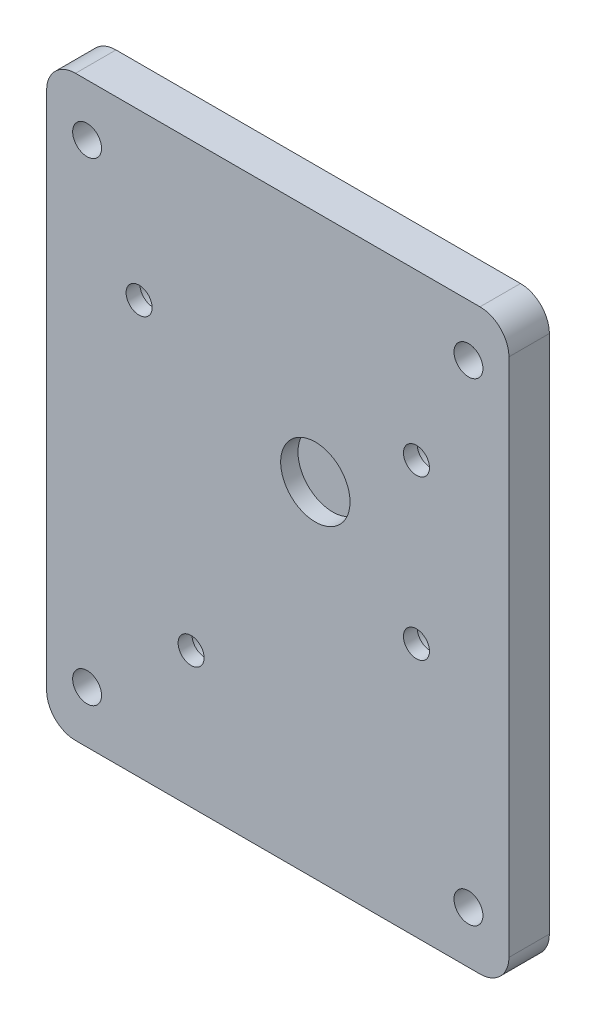
ISO-10303-21;
HEADER;
FILE_DESCRIPTION(('STEP AP214'),'2;1');
FILE_NAME('part.step','',(''),(''),'','','');
FILE_SCHEMA(('AUTOMOTIVE_DESIGN { 1 0 10303 214 1 1 1 1 }'));
ENDSEC;
DATA;
#1=APPLICATION_CONTEXT('core data for automotive mechanical design processes');
#2=APPLICATION_PROTOCOL_DEFINITION('international standard','automotive_design',2000,#1);
#3=PRODUCT_CONTEXT('',#1,'mechanical');
#4=PRODUCT('Part','Part','',(#3));
#5=PRODUCT_RELATED_PRODUCT_CATEGORY('part','',(#4));
#6=PRODUCT_DEFINITION_FORMATION('','',#4);
#7=PRODUCT_DEFINITION_CONTEXT('part definition',#1,'design');
#8=PRODUCT_DEFINITION('design','',#6,#7);
#9=PRODUCT_DEFINITION_SHAPE('','',#8);
#10=(LENGTH_UNIT() NAMED_UNIT(*) SI_UNIT(.MILLI.,.METRE.));
#11=(NAMED_UNIT(*) PLANE_ANGLE_UNIT() SI_UNIT($,.RADIAN.));
#12=(NAMED_UNIT(*) SI_UNIT($,.STERADIAN.) SOLID_ANGLE_UNIT());
#13=UNCERTAINTY_MEASURE_WITH_UNIT(LENGTH_MEASURE(1.E-05),#10,'distance_accuracy_value','');
#14=(GEOMETRIC_REPRESENTATION_CONTEXT(3) GLOBAL_UNCERTAINTY_ASSIGNED_CONTEXT((#13)) GLOBAL_UNIT_ASSIGNED_CONTEXT((#10,
#11,#12)) REPRESENTATION_CONTEXT('',''));
#15=CARTESIAN_POINT('',(0.,0.,0.));
#16=DIRECTION('',(0.,0.,1.));
#17=DIRECTION('',(1.,0.,0.));
#18=AXIS2_PLACEMENT_3D('',#15,#16,#17);
#19=CARTESIAN_POINT('',(6.5,9.5,0.));
#20=DIRECTION('',(0.,0.,1.));
#21=DIRECTION('',(1.,0.,0.));
#22=AXIS2_PLACEMENT_3D('',#19,#20,#21);
#23=CYLINDRICAL_SURFACE('',#22,6.);
#24=CARTESIAN_POINT('',(6.5,9.5,23.5));
#25=DIRECTION('',(0.,0.,1.));
#26=DIRECTION('',(1.,0.,0.));
#27=AXIS2_PLACEMENT_3D('',#24,#25,#26);
#28=CIRCLE('',#27,6.);
#29=CARTESIAN_POINT('',(12.5,9.5,23.5));
#30=VERTEX_POINT('',#29);
#31=EDGE_CURVE('E280',#30,#30,#28,.T.);
#32=ORIENTED_EDGE('',*,*,#31,.T.);
#33=EDGE_LOOP('',(#32));
#34=FACE_BOUND('',#33,.T.);
#35=CARTESIAN_POINT('',(6.5,9.5,20.5));
#36=DIRECTION('',(0.,0.,-1.));
#37=DIRECTION('',(-1.,0.,0.));
#38=AXIS2_PLACEMENT_3D('',#35,#36,#37);
#39=CIRCLE('',#38,6.);
#40=CARTESIAN_POINT('',(0.500000000000002,9.5,20.5));
#41=VERTEX_POINT('',#40);
#42=EDGE_CURVE('E151',#41,#41,#39,.F.);
#43=ORIENTED_EDGE('',*,*,#42,.F.);
#44=EDGE_LOOP('',(#43));
#45=FACE_BOUND('',#44,.T.);
#46=ADVANCED_FACE('F48',(#34,#45),#23,.F.);
#47=CARTESIAN_POINT('',(0.,0.,16.5));
#48=DIRECTION('',(0.,0.,1.));
#49=DIRECTION('',(1.,0.,0.));
#50=AXIS2_PLACEMENT_3D('',#47,#48,#49);
#51=PLANE('',#50);
#52=CARTESIAN_POINT('',(33.,41.,16.5));
#53=DIRECTION('',(0.,0.,1.));
#54=DIRECTION('',(1.,0.,0.));
#55=AXIS2_PLACEMENT_3D('',#52,#53,#54);
#56=CIRCLE('',#55,2.49999999999999);
#57=CARTESIAN_POINT('',(35.5,41.,16.5));
#58=VERTEX_POINT('',#57);
#59=EDGE_CURVE('E373',#58,#58,#56,.T.);
#60=ORIENTED_EDGE('',*,*,#59,.T.);
#61=EDGE_LOOP('',(#60));
#62=FACE_BOUND('',#61,.T.);
#63=CARTESIAN_POINT('',(-33.,41.,16.5));
#64=DIRECTION('',(0.,0.,1.));
#65=DIRECTION('',(1.,0.,0.));
#66=AXIS2_PLACEMENT_3D('',#63,#64,#65);
#67=CIRCLE('',#66,2.49999999999999);
#68=CARTESIAN_POINT('',(-30.5,41.,16.5));
#69=VERTEX_POINT('',#68);
#70=EDGE_CURVE('E363',#69,#69,#67,.T.);
#71=ORIENTED_EDGE('',*,*,#70,.T.);
#72=EDGE_LOOP('',(#71));
#73=FACE_BOUND('',#72,.T.);
#74=CARTESIAN_POINT('',(-33.,-41.,16.5));
#75=DIRECTION('',(0.,0.,1.));
#76=DIRECTION('',(1.,0.,0.));
#77=AXIS2_PLACEMENT_3D('',#74,#75,#76);
#78=CIRCLE('',#77,2.49999999999999);
#79=CARTESIAN_POINT('',(-30.5,-41.,16.5));
#80=VERTEX_POINT('',#79);
#81=EDGE_CURVE('E354',#80,#80,#78,.T.);
#82=ORIENTED_EDGE('',*,*,#81,.T.);
#83=EDGE_LOOP('',(#82));
#84=FACE_BOUND('',#83,.T.);
#85=CARTESIAN_POINT('',(33.,-41.,16.5));
#86=DIRECTION('',(0.,0.,1.));
#87=DIRECTION('',(1.,0.,0.));
#88=AXIS2_PLACEMENT_3D('',#85,#86,#87);
#89=CIRCLE('',#88,2.49999999999999);
#90=CARTESIAN_POINT('',(35.5,-41.,16.5));
#91=VERTEX_POINT('',#90);
#92=EDGE_CURVE('E335',#91,#91,#89,.T.);
#93=ORIENTED_EDGE('',*,*,#92,.T.);
#94=EDGE_LOOP('',(#93));
#95=FACE_BOUND('',#94,.T.);
#96=CARTESIAN_POINT('',(24.,-6.,16.5));
#97=DIRECTION('',(0.,0.,-1.));
#98=DIRECTION('',(-1.,0.,0.));
#99=AXIS2_PLACEMENT_3D('',#96,#97,#98);
#100=CIRCLE('',#99,4.);
#101=CARTESIAN_POINT('',(20.,-6.,16.5));
#102=VERTEX_POINT('',#101);
#103=EDGE_CURVE('E236',#102,#102,#100,.T.);
#104=ORIENTED_EDGE('',*,*,#103,.F.);
#105=EDGE_LOOP('',(#104));
#106=FACE_BOUND('',#105,.T.);
#107=CARTESIAN_POINT('',(-15.,-26.5,16.5));
#108=DIRECTION('',(0.,0.,1.));
#109=DIRECTION('',(1.,0.,0.));
#110=AXIS2_PLACEMENT_3D('',#107,#108,#109);
#111=CIRCLE('',#110,4.);
#112=CARTESIAN_POINT('',(-11.,-26.5,16.5));
#113=VERTEX_POINT('',#112);
#114=EDGE_CURVE('E284',#113,#113,#111,.T.);
#115=ORIENTED_EDGE('',*,*,#114,.T.);
#116=EDGE_LOOP('',(#115));
#117=FACE_BOUND('',#116,.T.);
#118=DIRECTION('',(1.,0.,0.));
#119=VECTOR('',#118,1.);
#120=CARTESIAN_POINT('',(-40.,50.,16.5));
#121=LINE('',#120,#119);
#122=CARTESIAN_POINT('',(-35.,50.,16.5));
#123=VERTEX_POINT('',#122);
#124=CARTESIAN_POINT('',(35.,50.,16.5));
#125=VERTEX_POINT('',#124);
#126=EDGE_CURVE('E122',#123,#125,#121,.T.);
#127=ORIENTED_EDGE('',*,*,#126,.T.);
#128=CARTESIAN_POINT('',(35.,45.,16.5));
#129=DIRECTION('',(0.,0.,1.));
#130=DIRECTION('',(1.,0.,0.));
#131=AXIS2_PLACEMENT_3D('',#128,#129,#130);
#132=CIRCLE('',#131,5.);
#133=CARTESIAN_POINT('',(40.,45.,16.5));
#134=VERTEX_POINT('',#133);
#135=EDGE_CURVE('E115',#125,#134,#132,.F.);
#136=ORIENTED_EDGE('',*,*,#135,.T.);
#137=DIRECTION('',(0.,-1.,0.));
#138=VECTOR('',#137,1.);
#139=CARTESIAN_POINT('',(40.,-50.,16.5));
#140=LINE('',#139,#138);
#141=CARTESIAN_POINT('',(40.,-45.,16.5));
#142=VERTEX_POINT('',#141);
#143=EDGE_CURVE('E119',#134,#142,#140,.T.);
#144=ORIENTED_EDGE('',*,*,#143,.T.);
#145=CARTESIAN_POINT('',(35.,-45.,16.5));
#146=DIRECTION('',(0.,0.,1.));
#147=DIRECTION('',(1.,0.,0.));
#148=AXIS2_PLACEMENT_3D('',#145,#146,#147);
#149=CIRCLE('',#148,5.);
#150=CARTESIAN_POINT('',(35.,-50.,16.5));
#151=VERTEX_POINT('',#150);
#152=EDGE_CURVE('E128',#142,#151,#149,.F.);
#153=ORIENTED_EDGE('',*,*,#152,.T.);
#154=DIRECTION('',(-1.,0.,0.));
#155=VECTOR('',#154,1.);
#156=CARTESIAN_POINT('',(-40.,-50.,16.5));
#157=LINE('',#156,#155);
#158=CARTESIAN_POINT('',(-35.,-50.,16.5));
#159=VERTEX_POINT('',#158);
#160=EDGE_CURVE('E139',#151,#159,#157,.T.);
#161=ORIENTED_EDGE('',*,*,#160,.T.);
#162=CARTESIAN_POINT('',(-35.,-45.,16.5));
#163=DIRECTION('',(0.,0.,1.));
#164=DIRECTION('',(1.,0.,0.));
#165=AXIS2_PLACEMENT_3D('',#162,#163,#164);
#166=CIRCLE('',#165,5.);
#167=CARTESIAN_POINT('',(-40.,-45.,16.5));
#168=VERTEX_POINT('',#167);
#169=EDGE_CURVE('E70',#159,#168,#166,.F.);
#170=ORIENTED_EDGE('',*,*,#169,.T.);
#171=DIRECTION('',(0.,1.,0.));
#172=VECTOR('',#171,1.);
#173=CARTESIAN_POINT('',(-40.,-50.,16.5));
#174=LINE('',#173,#172);
#175=CARTESIAN_POINT('',(-40.,45.,16.5));
#176=VERTEX_POINT('',#175);
#177=EDGE_CURVE('E209',#168,#176,#174,.T.);
#178=ORIENTED_EDGE('',*,*,#177,.T.);
#179=CARTESIAN_POINT('',(-35.,45.,16.5));
#180=DIRECTION('',(0.,0.,1.));
#181=DIRECTION('',(1.,0.,0.));
#182=AXIS2_PLACEMENT_3D('',#179,#180,#181);
#183=CIRCLE('',#182,5.);
#184=EDGE_CURVE('E169',#176,#123,#183,.F.);
#185=ORIENTED_EDGE('',*,*,#184,.T.);
#186=EDGE_LOOP('',(#127,#136,#144,#153,#161,#170,#178,#185));
#187=FACE_BOUND('',#186,.T.);
#188=CARTESIAN_POINT('',(-24.,21.5,16.5));
#189=DIRECTION('',(0.,0.,-1.));
#190=DIRECTION('',(-1.,0.,0.));
#191=AXIS2_PLACEMENT_3D('',#188,#189,#190);
#192=CIRCLE('',#191,4.);
#193=CARTESIAN_POINT('',(-28.,21.5,16.5));
#194=VERTEX_POINT('',#193);
#195=EDGE_CURVE('E264',#194,#194,#192,.T.);
#196=ORIENTED_EDGE('',*,*,#195,.F.);
#197=EDGE_LOOP('',(#196));
#198=FACE_BOUND('',#197,.T.);
#199=CARTESIAN_POINT('',(24.,21.5,16.5));
#200=DIRECTION('',(0.,0.,-1.));
#201=DIRECTION('',(-1.,0.,0.));
#202=AXIS2_PLACEMENT_3D('',#199,#200,#201);
#203=CIRCLE('',#202,4.);
#204=CARTESIAN_POINT('',(20.,21.5,16.5));
#205=VERTEX_POINT('',#204);
#206=EDGE_CURVE('E220',#205,#205,#203,.T.);
#207=ORIENTED_EDGE('',*,*,#206,.F.);
#208=EDGE_LOOP('',(#207));
#209=FACE_BOUND('',#208,.T.);
#210=ADVANCED_FACE('F117',(#62,#73,#84,#95,#106,#117,#187,#198,#209),#51,.F.);
#211=CARTESIAN_POINT('',(0.,0.,23.5));
#212=DIRECTION('',(0.,0.,1.));
#213=DIRECTION('',(1.,0.,0.));
#214=AXIS2_PLACEMENT_3D('',#211,#212,#213);
#215=PLANE('',#214);
#216=CARTESIAN_POINT('',(33.,41.,23.5));
#217=DIRECTION('',(0.,0.,1.));
#218=DIRECTION('',(1.,0.,0.));
#219=AXIS2_PLACEMENT_3D('',#216,#217,#218);
#220=CIRCLE('',#219,2.49999999999999);
#221=CARTESIAN_POINT('',(35.5,41.,23.5));
#222=VERTEX_POINT('',#221);
#223=EDGE_CURVE('E378',#222,#222,#220,.T.);
#224=ORIENTED_EDGE('',*,*,#223,.F.);
#225=EDGE_LOOP('',(#224));
#226=FACE_BOUND('',#225,.T.);
#227=CARTESIAN_POINT('',(-33.,41.,23.5));
#228=DIRECTION('',(0.,0.,1.));
#229=DIRECTION('',(1.,0.,0.));
#230=AXIS2_PLACEMENT_3D('',#227,#228,#229);
#231=CIRCLE('',#230,2.49999999999999);
#232=CARTESIAN_POINT('',(-30.5,41.,23.5));
#233=VERTEX_POINT('',#232);
#234=EDGE_CURVE('E368',#233,#233,#231,.T.);
#235=ORIENTED_EDGE('',*,*,#234,.F.);
#236=EDGE_LOOP('',(#235));
#237=FACE_BOUND('',#236,.T.);
#238=CARTESIAN_POINT('',(-33.,-41.,23.5));
#239=DIRECTION('',(0.,0.,1.));
#240=DIRECTION('',(1.,0.,0.));
#241=AXIS2_PLACEMENT_3D('',#238,#239,#240);
#242=CIRCLE('',#241,2.49999999999999);
#243=CARTESIAN_POINT('',(-30.5,-41.,23.5));
#244=VERTEX_POINT('',#243);
#245=EDGE_CURVE('E358',#244,#244,#242,.T.);
#246=ORIENTED_EDGE('',*,*,#245,.F.);
#247=EDGE_LOOP('',(#246));
#248=FACE_BOUND('',#247,.T.);
#249=CARTESIAN_POINT('',(33.,-41.,23.5));
#250=DIRECTION('',(0.,0.,1.));
#251=DIRECTION('',(1.,0.,0.));
#252=AXIS2_PLACEMENT_3D('',#249,#250,#251);
#253=CIRCLE('',#252,2.49999999999999);
#254=CARTESIAN_POINT('',(35.5,-41.,23.5));
#255=VERTEX_POINT('',#254);
#256=EDGE_CURVE('E350',#255,#255,#253,.T.);
#257=ORIENTED_EDGE('',*,*,#256,.F.);
#258=EDGE_LOOP('',(#257));
#259=FACE_BOUND('',#258,.T.);
#260=CARTESIAN_POINT('',(24.,21.5,23.5));
#261=DIRECTION('',(0.,0.,-1.));
#262=DIRECTION('',(-1.,0.,0.));
#263=AXIS2_PLACEMENT_3D('',#260,#261,#262);
#264=CIRCLE('',#263,2.25);
#265=CARTESIAN_POINT('',(21.75,21.5,23.5));
#266=VERTEX_POINT('',#265);
#267=EDGE_CURVE('E232',#266,#266,#264,.T.);
#268=ORIENTED_EDGE('',*,*,#267,.T.);
#269=EDGE_LOOP('',(#268));
#270=FACE_BOUND('',#269,.T.);
#271=CARTESIAN_POINT('',(24.,-6.,23.5));
#272=DIRECTION('',(0.,0.,-1.));
#273=DIRECTION('',(-1.,0.,0.));
#274=AXIS2_PLACEMENT_3D('',#271,#272,#273);
#275=CIRCLE('',#274,2.25);
#276=CARTESIAN_POINT('',(21.75,-6.,23.5));
#277=VERTEX_POINT('',#276);
#278=EDGE_CURVE('E248',#277,#277,#275,.T.);
#279=ORIENTED_EDGE('',*,*,#278,.T.);
#280=EDGE_LOOP('',(#279));
#281=FACE_BOUND('',#280,.T.);
#282=CARTESIAN_POINT('',(-15.,-26.5,23.5));
#283=DIRECTION('',(0.,0.,-1.));
#284=DIRECTION('',(-1.,0.,0.));
#285=AXIS2_PLACEMENT_3D('',#282,#283,#284);
#286=CIRCLE('',#285,2.25);
#287=CARTESIAN_POINT('',(-17.25,-26.5,23.5));
#288=VERTEX_POINT('',#287);
#289=EDGE_CURVE('E260',#288,#288,#286,.T.);
#290=ORIENTED_EDGE('',*,*,#289,.T.);
#291=EDGE_LOOP('',(#290));
#292=FACE_BOUND('',#291,.T.);
#293=CARTESIAN_POINT('',(-24.,21.5,23.5));
#294=DIRECTION('',(0.,0.,-1.));
#295=DIRECTION('',(-1.,0.,0.));
#296=AXIS2_PLACEMENT_3D('',#293,#294,#295);
#297=CIRCLE('',#296,2.25);
#298=CARTESIAN_POINT('',(-26.25,21.5,23.5));
#299=VERTEX_POINT('',#298);
#300=EDGE_CURVE('E276',#299,#299,#297,.T.);
#301=ORIENTED_EDGE('',*,*,#300,.T.);
#302=EDGE_LOOP('',(#301));
#303=FACE_BOUND('',#302,.T.);
#304=ORIENTED_EDGE('',*,*,#31,.F.);
#305=EDGE_LOOP('',(#304));
#306=FACE_BOUND('',#305,.T.);
#307=DIRECTION('',(0.,1.,0.));
#308=VECTOR('',#307,1.);
#309=CARTESIAN_POINT('',(40.,-50.,23.5));
#310=LINE('',#309,#308);
#311=CARTESIAN_POINT('',(40.,-45.,23.5));
#312=VERTEX_POINT('',#311);
#313=CARTESIAN_POINT('',(40.,45.,23.5));
#314=VERTEX_POINT('',#313);
#315=EDGE_CURVE('E340',#312,#314,#310,.T.);
#316=ORIENTED_EDGE('',*,*,#315,.T.);
#317=CARTESIAN_POINT('',(35.,45.,23.5));
#318=DIRECTION('',(0.,0.,1.));
#319=DIRECTION('',(1.,0.,0.));
#320=AXIS2_PLACEMENT_3D('',#317,#318,#319);
#321=CIRCLE('',#320,5.);
#322=CARTESIAN_POINT('',(35.,50.,23.5));
#323=VERTEX_POINT('',#322);
#324=EDGE_CURVE('E142',#314,#323,#321,.T.);
#325=ORIENTED_EDGE('',*,*,#324,.T.);
#326=DIRECTION('',(-1.,0.,0.));
#327=VECTOR('',#326,1.);
#328=CARTESIAN_POINT('',(-40.,50.,23.5));
#329=LINE('',#328,#327);
#330=CARTESIAN_POINT('',(-35.,50.,23.5));
#331=VERTEX_POINT('',#330);
#332=EDGE_CURVE('E216',#323,#331,#329,.T.);
#333=ORIENTED_EDGE('',*,*,#332,.T.);
#334=CARTESIAN_POINT('',(-35.,45.,23.5));
#335=DIRECTION('',(0.,0.,1.));
#336=DIRECTION('',(1.,0.,0.));
#337=AXIS2_PLACEMENT_3D('',#334,#335,#336);
#338=CIRCLE('',#337,5.);
#339=CARTESIAN_POINT('',(-40.,45.,23.5));
#340=VERTEX_POINT('',#339);
#341=EDGE_CURVE('E144',#331,#340,#338,.T.);
#342=ORIENTED_EDGE('',*,*,#341,.T.);
#343=DIRECTION('',(0.,-1.,0.));
#344=VECTOR('',#343,1.);
#345=CARTESIAN_POINT('',(-40.,-50.,23.5));
#346=LINE('',#345,#344);
#347=CARTESIAN_POINT('',(-40.,-45.,23.5));
#348=VERTEX_POINT('',#347);
#349=EDGE_CURVE('E210',#340,#348,#346,.T.);
#350=ORIENTED_EDGE('',*,*,#349,.T.);
#351=CARTESIAN_POINT('',(-35.,-45.,23.5));
#352=DIRECTION('',(0.,0.,1.));
#353=DIRECTION('',(1.,0.,0.));
#354=AXIS2_PLACEMENT_3D('',#351,#352,#353);
#355=CIRCLE('',#354,5.);
#356=CARTESIAN_POINT('',(-35.,-50.,23.5));
#357=VERTEX_POINT('',#356);
#358=EDGE_CURVE('E149',#348,#357,#355,.T.);
#359=ORIENTED_EDGE('',*,*,#358,.T.);
#360=DIRECTION('',(1.,0.,0.));
#361=VECTOR('',#360,1.);
#362=CARTESIAN_POINT('',(-40.,-50.,23.5));
#363=LINE('',#362,#361);
#364=CARTESIAN_POINT('',(35.,-50.,23.5));
#365=VERTEX_POINT('',#364);
#366=EDGE_CURVE('E202',#357,#365,#363,.T.);
#367=ORIENTED_EDGE('',*,*,#366,.T.);
#368=CARTESIAN_POINT('',(35.,-45.,23.5));
#369=DIRECTION('',(0.,0.,1.));
#370=DIRECTION('',(1.,0.,0.));
#371=AXIS2_PLACEMENT_3D('',#368,#369,#370);
#372=CIRCLE('',#371,5.);
#373=EDGE_CURVE('E157',#365,#312,#372,.T.);
#374=ORIENTED_EDGE('',*,*,#373,.T.);
#375=EDGE_LOOP('',(#316,#325,#333,#342,#350,#359,#367,#374));
#376=FACE_BOUND('',#375,.T.);
#377=ADVANCED_FACE('F206',(#226,#237,#248,#259,#270,#281,#292,#303,#306,#376),#215,.T.);
#378=CARTESIAN_POINT('',(-21.75,21.5,21.1));
#379=DIRECTION('',(0.,0.,1.));
#380=DIRECTION('',(1.,0.,0.));
#381=AXIS2_PLACEMENT_3D('',#378,#379,#380);
#382=PLANE('',#381);
#383=CARTESIAN_POINT('',(-24.,21.5,21.1));
#384=DIRECTION('',(0.,0.,-1.));
#385=DIRECTION('',(-1.,0.,0.));
#386=AXIS2_PLACEMENT_3D('',#383,#384,#385);
#387=CIRCLE('',#386,2.25);
#388=CARTESIAN_POINT('',(-26.25,21.5,21.1));
#389=VERTEX_POINT('',#388);
#390=EDGE_CURVE('E272',#389,#389,#387,.T.);
#391=ORIENTED_EDGE('',*,*,#390,.F.);
#392=EDGE_LOOP('',(#391));
#393=FACE_BOUND('',#392,.T.);
#394=CARTESIAN_POINT('',(-24.,21.5,21.1));
#395=DIRECTION('',(0.,0.,-1.));
#396=DIRECTION('',(-1.,0.,0.));
#397=AXIS2_PLACEMENT_3D('',#394,#395,#396);
#398=CIRCLE('',#397,4.);
#399=CARTESIAN_POINT('',(-28.,21.5,21.1));
#400=VERTEX_POINT('',#399);
#401=EDGE_CURVE('E268',#400,#400,#398,.T.);
#402=ORIENTED_EDGE('',*,*,#401,.T.);
#403=EDGE_LOOP('',(#402));
#404=FACE_BOUND('',#403,.T.);
#405=ADVANCED_FACE('F308',(#393,#404),#382,.F.);
#406=CARTESIAN_POINT('',(-24.,21.5,16.5));
#407=DIRECTION('',(0.,0.,-1.));
#408=DIRECTION('',(-1.,0.,0.));
#409=AXIS2_PLACEMENT_3D('',#406,#407,#408);
#410=CYLINDRICAL_SURFACE('',#409,4.);
#411=ORIENTED_EDGE('',*,*,#401,.F.);
#412=EDGE_LOOP('',(#411));
#413=FACE_BOUND('',#412,.T.);
#414=ORIENTED_EDGE('',*,*,#195,.T.);
#415=EDGE_LOOP('',(#414));
#416=FACE_BOUND('',#415,.T.);
#417=ADVANCED_FACE('F407',(#413,#416),#410,.F.);
#418=CARTESIAN_POINT('',(-24.,21.5,16.5));
#419=DIRECTION('',(0.,0.,-1.));
#420=DIRECTION('',(-1.,0.,0.));
#421=AXIS2_PLACEMENT_3D('',#418,#419,#420);
#422=CYLINDRICAL_SURFACE('',#421,2.25);
#423=ORIENTED_EDGE('',*,*,#300,.F.);
#424=EDGE_LOOP('',(#423));
#425=FACE_BOUND('',#424,.T.);
#426=ORIENTED_EDGE('',*,*,#390,.T.);
#427=EDGE_LOOP('',(#426));
#428=FACE_BOUND('',#427,.T.);
#429=ADVANCED_FACE('F306',(#425,#428),#422,.F.);
#430=CARTESIAN_POINT('',(-12.75,-26.5,21.1));
#431=DIRECTION('',(0.,0.,1.));
#432=DIRECTION('',(1.,0.,0.));
#433=AXIS2_PLACEMENT_3D('',#430,#431,#432);
#434=PLANE('',#433);
#435=CARTESIAN_POINT('',(-15.,-26.5,21.1));
#436=DIRECTION('',(0.,0.,-1.));
#437=DIRECTION('',(-1.,0.,0.));
#438=AXIS2_PLACEMENT_3D('',#435,#436,#437);
#439=CIRCLE('',#438,2.25);
#440=CARTESIAN_POINT('',(-17.25,-26.5,21.1));
#441=VERTEX_POINT('',#440);
#442=EDGE_CURVE('E256',#441,#441,#439,.T.);
#443=ORIENTED_EDGE('',*,*,#442,.F.);
#444=EDGE_LOOP('',(#443));
#445=FACE_BOUND('',#444,.T.);
#446=CARTESIAN_POINT('',(-15.,-26.5,21.1));
#447=DIRECTION('',(0.,0.,-1.));
#448=DIRECTION('',(-1.,0.,0.));
#449=AXIS2_PLACEMENT_3D('',#446,#447,#448);
#450=CIRCLE('',#449,4.);
#451=CARTESIAN_POINT('',(-19.,-26.5,21.1));
#452=VERTEX_POINT('',#451);
#453=EDGE_CURVE('E252',#452,#452,#450,.T.);
#454=ORIENTED_EDGE('',*,*,#453,.T.);
#455=EDGE_LOOP('',(#454));
#456=FACE_BOUND('',#455,.T.);
#457=ADVANCED_FACE('F406',(#445,#456),#434,.F.);
#458=CARTESIAN_POINT('',(-15.,-26.5,16.5));
#459=DIRECTION('',(0.,0.,-1.));
#460=DIRECTION('',(-1.,0.,0.));
#461=AXIS2_PLACEMENT_3D('',#458,#459,#460);
#462=CYLINDRICAL_SURFACE('',#461,4.);
#463=ORIENTED_EDGE('',*,*,#453,.F.);
#464=EDGE_LOOP('',(#463));
#465=FACE_BOUND('',#464,.T.);
#466=ORIENTED_EDGE('',*,*,#114,.F.);
#467=EDGE_LOOP('',(#466));
#468=FACE_BOUND('',#467,.T.);
#469=ADVANCED_FACE('F452',(#465,#468),#462,.F.);
#470=CARTESIAN_POINT('',(-15.,-26.5,16.5));
#471=DIRECTION('',(0.,0.,-1.));
#472=DIRECTION('',(-1.,0.,0.));
#473=AXIS2_PLACEMENT_3D('',#470,#471,#472);
#474=CYLINDRICAL_SURFACE('',#473,2.25);
#475=ORIENTED_EDGE('',*,*,#289,.F.);
#476=EDGE_LOOP('',(#475));
#477=FACE_BOUND('',#476,.T.);
#478=ORIENTED_EDGE('',*,*,#442,.T.);
#479=EDGE_LOOP('',(#478));
#480=FACE_BOUND('',#479,.T.);
#481=ADVANCED_FACE('F447',(#477,#480),#474,.F.);
#482=CARTESIAN_POINT('',(26.25,-6.,21.1));
#483=DIRECTION('',(0.,0.,1.));
#484=DIRECTION('',(1.,0.,0.));
#485=AXIS2_PLACEMENT_3D('',#482,#483,#484);
#486=PLANE('',#485);
#487=CARTESIAN_POINT('',(24.,-6.,21.1));
#488=DIRECTION('',(0.,0.,-1.));
#489=DIRECTION('',(-1.,0.,0.));
#490=AXIS2_PLACEMENT_3D('',#487,#488,#489);
#491=CIRCLE('',#490,2.25);
#492=CARTESIAN_POINT('',(21.75,-6.,21.1));
#493=VERTEX_POINT('',#492);
#494=EDGE_CURVE('E244',#493,#493,#491,.T.);
#495=ORIENTED_EDGE('',*,*,#494,.F.);
#496=EDGE_LOOP('',(#495));
#497=FACE_BOUND('',#496,.T.);
#498=CARTESIAN_POINT('',(24.,-6.,21.1));
#499=DIRECTION('',(0.,0.,-1.));
#500=DIRECTION('',(-1.,0.,0.));
#501=AXIS2_PLACEMENT_3D('',#498,#499,#500);
#502=CIRCLE('',#501,4.);
#503=CARTESIAN_POINT('',(20.,-6.,21.1));
#504=VERTEX_POINT('',#503);
#505=EDGE_CURVE('E240',#504,#504,#502,.T.);
#506=ORIENTED_EDGE('',*,*,#505,.T.);
#507=EDGE_LOOP('',(#506));
#508=FACE_BOUND('',#507,.T.);
#509=ADVANCED_FACE('F443',(#497,#508),#486,.F.);
#510=CARTESIAN_POINT('',(24.,-6.,16.5));
#511=DIRECTION('',(0.,0.,-1.));
#512=DIRECTION('',(-1.,0.,0.));
#513=AXIS2_PLACEMENT_3D('',#510,#511,#512);
#514=CYLINDRICAL_SURFACE('',#513,4.);
#515=ORIENTED_EDGE('',*,*,#505,.F.);
#516=EDGE_LOOP('',(#515));
#517=FACE_BOUND('',#516,.T.);
#518=ORIENTED_EDGE('',*,*,#103,.T.);
#519=EDGE_LOOP('',(#518));
#520=FACE_BOUND('',#519,.T.);
#521=ADVANCED_FACE('F440',(#517,#520),#514,.F.);
#522=CARTESIAN_POINT('',(24.,-6.,16.5));
#523=DIRECTION('',(0.,0.,-1.));
#524=DIRECTION('',(-1.,0.,0.));
#525=AXIS2_PLACEMENT_3D('',#522,#523,#524);
#526=CYLINDRICAL_SURFACE('',#525,2.25);
#527=ORIENTED_EDGE('',*,*,#278,.F.);
#528=EDGE_LOOP('',(#527));
#529=FACE_BOUND('',#528,.T.);
#530=ORIENTED_EDGE('',*,*,#494,.T.);
#531=EDGE_LOOP('',(#530));
#532=FACE_BOUND('',#531,.T.);
#533=ADVANCED_FACE('F433',(#529,#532),#526,.F.);
#534=CARTESIAN_POINT('',(26.25,21.5,21.1));
#535=DIRECTION('',(0.,0.,1.));
#536=DIRECTION('',(1.,0.,0.));
#537=AXIS2_PLACEMENT_3D('',#534,#535,#536);
#538=PLANE('',#537);
#539=CARTESIAN_POINT('',(24.,21.5,21.1));
#540=DIRECTION('',(0.,0.,-1.));
#541=DIRECTION('',(-1.,0.,0.));
#542=AXIS2_PLACEMENT_3D('',#539,#540,#541);
#543=CIRCLE('',#542,2.25);
#544=CARTESIAN_POINT('',(21.75,21.5,21.1));
#545=VERTEX_POINT('',#544);
#546=EDGE_CURVE('E228',#545,#545,#543,.T.);
#547=ORIENTED_EDGE('',*,*,#546,.F.);
#548=EDGE_LOOP('',(#547));
#549=FACE_BOUND('',#548,.T.);
#550=CARTESIAN_POINT('',(24.,21.5,21.1));
#551=DIRECTION('',(0.,0.,-1.));
#552=DIRECTION('',(-1.,0.,0.));
#553=AXIS2_PLACEMENT_3D('',#550,#551,#552);
#554=CIRCLE('',#553,4.);
#555=CARTESIAN_POINT('',(20.,21.5,21.1));
#556=VERTEX_POINT('',#555);
#557=EDGE_CURVE('E224',#556,#556,#554,.T.);
#558=ORIENTED_EDGE('',*,*,#557,.T.);
#559=EDGE_LOOP('',(#558));
#560=FACE_BOUND('',#559,.T.);
#561=ADVANCED_FACE('F424',(#549,#560),#538,.F.);
#562=CARTESIAN_POINT('',(24.,21.5,16.5));
#563=DIRECTION('',(0.,0.,-1.));
#564=DIRECTION('',(-1.,0.,0.));
#565=AXIS2_PLACEMENT_3D('',#562,#563,#564);
#566=CYLINDRICAL_SURFACE('',#565,4.);
#567=ORIENTED_EDGE('',*,*,#557,.F.);
#568=EDGE_LOOP('',(#567));
#569=FACE_BOUND('',#568,.T.);
#570=ORIENTED_EDGE('',*,*,#206,.T.);
#571=EDGE_LOOP('',(#570));
#572=FACE_BOUND('',#571,.T.);
#573=ADVANCED_FACE('F421',(#569,#572),#566,.F.);
#574=CARTESIAN_POINT('',(24.,21.5,16.5));
#575=DIRECTION('',(0.,0.,-1.));
#576=DIRECTION('',(-1.,0.,0.));
#577=AXIS2_PLACEMENT_3D('',#574,#575,#576);
#578=CYLINDRICAL_SURFACE('',#577,2.25);
#579=ORIENTED_EDGE('',*,*,#267,.F.);
#580=EDGE_LOOP('',(#579));
#581=FACE_BOUND('',#580,.T.);
#582=ORIENTED_EDGE('',*,*,#546,.T.);
#583=EDGE_LOOP('',(#582));
#584=FACE_BOUND('',#583,.T.);
#585=ADVANCED_FACE('F423',(#581,#584),#578,.F.);
#586=CARTESIAN_POINT('',(-40.,50.,-111.562484748657));
#587=DIRECTION('',(0.,1.,0.));
#588=DIRECTION('',(0.,0.,1.));
#589=AXIS2_PLACEMENT_3D('',#586,#587,#588);
#590=PLANE('',#589);
#591=ORIENTED_EDGE('',*,*,#332,.F.);
#592=DIRECTION('',(0.,0.,1.));
#593=VECTOR('',#592,1.);
#594=CARTESIAN_POINT('',(35.,50.,-111.562484748657));
#595=LINE('',#594,#593);
#596=EDGE_CURVE('E166',#323,#125,#595,.F.);
#597=ORIENTED_EDGE('',*,*,#596,.T.);
#598=ORIENTED_EDGE('',*,*,#126,.F.);
#599=DIRECTION('',(0.,0.,1.));
#600=VECTOR('',#599,1.);
#601=CARTESIAN_POINT('',(-35.,50.,-111.562484748657));
#602=LINE('',#601,#600);
#603=EDGE_CURVE('E162',#123,#331,#602,.T.);
#604=ORIENTED_EDGE('',*,*,#603,.T.);
#605=EDGE_LOOP('',(#591,#597,#598,#604));
#606=FACE_BOUND('',#605,.T.);
#607=ADVANCED_FACE('F330',(#606),#590,.T.);
#608=CARTESIAN_POINT('',(-40.,-50.,-111.562484748657));
#609=DIRECTION('',(-1.,0.,0.));
#610=DIRECTION('',(0.,0.,1.));
#611=AXIS2_PLACEMENT_3D('',#608,#609,#610);
#612=PLANE('',#611);
#613=ORIENTED_EDGE('',*,*,#177,.F.);
#614=DIRECTION('',(0.,0.,1.));
#615=VECTOR('',#614,1.);
#616=CARTESIAN_POINT('',(-40.,-45.,-111.562484748657));
#617=LINE('',#616,#615);
#618=EDGE_CURVE('E11',#168,#348,#617,.T.);
#619=ORIENTED_EDGE('',*,*,#618,.T.);
#620=ORIENTED_EDGE('',*,*,#349,.F.);
#621=DIRECTION('',(0.,0.,1.));
#622=VECTOR('',#621,1.);
#623=CARTESIAN_POINT('',(-40.,45.,-111.562484748657));
#624=LINE('',#623,#622);
#625=EDGE_CURVE('E57',#340,#176,#624,.F.);
#626=ORIENTED_EDGE('',*,*,#625,.T.);
#627=EDGE_LOOP('',(#613,#619,#620,#626));
#628=FACE_BOUND('',#627,.T.);
#629=ADVANCED_FACE('F324',(#628),#612,.T.);
#630=CARTESIAN_POINT('',(-40.,-50.,-111.562484748657));
#631=DIRECTION('',(0.,-1.,0.));
#632=DIRECTION('',(0.,0.,-1.));
#633=AXIS2_PLACEMENT_3D('',#630,#631,#632);
#634=PLANE('',#633);
#635=ORIENTED_EDGE('',*,*,#160,.F.);
#636=DIRECTION('',(0.,0.,1.));
#637=VECTOR('',#636,1.);
#638=CARTESIAN_POINT('',(35.,-50.,-111.562484748657));
#639=LINE('',#638,#637);
#640=EDGE_CURVE('E178',#151,#365,#639,.T.);
#641=ORIENTED_EDGE('',*,*,#640,.T.);
#642=ORIENTED_EDGE('',*,*,#366,.F.);
#643=DIRECTION('',(0.,0.,1.));
#644=VECTOR('',#643,1.);
#645=CARTESIAN_POINT('',(-35.,-50.,-111.562484748657));
#646=LINE('',#645,#644);
#647=EDGE_CURVE('E127',#357,#159,#646,.F.);
#648=ORIENTED_EDGE('',*,*,#647,.T.);
#649=EDGE_LOOP('',(#635,#641,#642,#648));
#650=FACE_BOUND('',#649,.T.);
#651=ADVANCED_FACE('F201',(#650),#634,.T.);
#652=CARTESIAN_POINT('',(40.,-50.,-111.562484748657));
#653=DIRECTION('',(1.,0.,0.));
#654=DIRECTION('',(0.,0.,-1.));
#655=AXIS2_PLACEMENT_3D('',#652,#653,#654);
#656=PLANE('',#655);
#657=ORIENTED_EDGE('',*,*,#143,.F.);
#658=DIRECTION('',(0.,0.,1.));
#659=VECTOR('',#658,1.);
#660=CARTESIAN_POINT('',(40.,45.,-111.562484748657));
#661=LINE('',#660,#659);
#662=EDGE_CURVE('E134',#134,#314,#661,.T.);
#663=ORIENTED_EDGE('',*,*,#662,.T.);
#664=ORIENTED_EDGE('',*,*,#315,.F.);
#665=DIRECTION('',(0.,0.,1.));
#666=VECTOR('',#665,1.);
#667=CARTESIAN_POINT('',(40.,-45.,-111.562484748657));
#668=LINE('',#667,#666);
#669=EDGE_CURVE('E137',#312,#142,#668,.F.);
#670=ORIENTED_EDGE('',*,*,#669,.T.);
#671=EDGE_LOOP('',(#657,#663,#664,#670));
#672=FACE_BOUND('',#671,.T.);
#673=ADVANCED_FACE('F132',(#672),#656,.T.);
#674=CARTESIAN_POINT('',(6.5,9.5,20.5));
#675=DIRECTION('',(0.,0.,-1.));
#676=DIRECTION('',(-1.,0.,0.));
#677=AXIS2_PLACEMENT_3D('',#674,#675,#676);
#678=PLANE('',#677);
#679=ORIENTED_EDGE('',*,*,#42,.T.);
#680=EDGE_LOOP('',(#679));
#681=FACE_BOUND('',#680,.T.);
#682=ADVANCED_FACE('F292',(#681),#678,.F.);
#683=CARTESIAN_POINT('',(35.,45.,-111.562484748657));
#684=DIRECTION('',(0.,0.,1.));
#685=DIRECTION('',(1.,0.,0.));
#686=AXIS2_PLACEMENT_3D('',#683,#684,#685);
#687=CYLINDRICAL_SURFACE('',#686,5.);
#688=ORIENTED_EDGE('',*,*,#135,.F.);
#689=ORIENTED_EDGE('',*,*,#596,.F.);
#690=ORIENTED_EDGE('',*,*,#324,.F.);
#691=ORIENTED_EDGE('',*,*,#662,.F.);
#692=EDGE_LOOP('',(#688,#689,#690,#691));
#693=FACE_BOUND('',#692,.T.);
#694=ADVANCED_FACE('F141',(#693),#687,.T.);
#695=CARTESIAN_POINT('',(35.,-45.,-111.562484748657));
#696=DIRECTION('',(0.,0.,1.));
#697=DIRECTION('',(1.,0.,0.));
#698=AXIS2_PLACEMENT_3D('',#695,#696,#697);
#699=CYLINDRICAL_SURFACE('',#698,5.);
#700=ORIENTED_EDGE('',*,*,#152,.F.);
#701=ORIENTED_EDGE('',*,*,#669,.F.);
#702=ORIENTED_EDGE('',*,*,#373,.F.);
#703=ORIENTED_EDGE('',*,*,#640,.F.);
#704=EDGE_LOOP('',(#700,#701,#702,#703));
#705=FACE_BOUND('',#704,.T.);
#706=ADVANCED_FACE('F313',(#705),#699,.T.);
#707=CARTESIAN_POINT('',(-35.,-45.,-111.562484748657));
#708=DIRECTION('',(0.,0.,1.));
#709=DIRECTION('',(1.,0.,0.));
#710=AXIS2_PLACEMENT_3D('',#707,#708,#709);
#711=CYLINDRICAL_SURFACE('',#710,5.);
#712=ORIENTED_EDGE('',*,*,#169,.F.);
#713=ORIENTED_EDGE('',*,*,#647,.F.);
#714=ORIENTED_EDGE('',*,*,#358,.F.);
#715=ORIENTED_EDGE('',*,*,#618,.F.);
#716=EDGE_LOOP('',(#712,#713,#714,#715));
#717=FACE_BOUND('',#716,.T.);
#718=ADVANCED_FACE('F315',(#717),#711,.T.);
#719=CARTESIAN_POINT('',(-35.,45.,-111.562484748657));
#720=DIRECTION('',(0.,0.,1.));
#721=DIRECTION('',(1.,0.,0.));
#722=AXIS2_PLACEMENT_3D('',#719,#720,#721);
#723=CYLINDRICAL_SURFACE('',#722,5.);
#724=ORIENTED_EDGE('',*,*,#184,.F.);
#725=ORIENTED_EDGE('',*,*,#625,.F.);
#726=ORIENTED_EDGE('',*,*,#341,.F.);
#727=ORIENTED_EDGE('',*,*,#603,.F.);
#728=EDGE_LOOP('',(#724,#725,#726,#727));
#729=FACE_BOUND('',#728,.T.);
#730=ADVANCED_FACE('F50',(#729),#723,.T.);
#731=CARTESIAN_POINT('',(33.,-41.,23.5));
#732=DIRECTION('',(0.,0.,1.));
#733=DIRECTION('',(1.,0.,0.));
#734=AXIS2_PLACEMENT_3D('',#731,#732,#733);
#735=CYLINDRICAL_SURFACE('',#734,2.49999999999999);
#736=ORIENTED_EDGE('',*,*,#256,.T.);
#737=EDGE_LOOP('',(#736));
#738=FACE_BOUND('',#737,.T.);
#739=ORIENTED_EDGE('',*,*,#92,.F.);
#740=EDGE_LOOP('',(#739));
#741=FACE_BOUND('',#740,.T.);
#742=ADVANCED_FACE('F321',(#738,#741),#735,.F.);
#743=CARTESIAN_POINT('',(-33.,-41.,23.5));
#744=DIRECTION('',(0.,0.,1.));
#745=DIRECTION('',(1.,0.,0.));
#746=AXIS2_PLACEMENT_3D('',#743,#744,#745);
#747=CYLINDRICAL_SURFACE('',#746,2.49999999999999);
#748=ORIENTED_EDGE('',*,*,#245,.T.);
#749=EDGE_LOOP('',(#748));
#750=FACE_BOUND('',#749,.T.);
#751=ORIENTED_EDGE('',*,*,#81,.F.);
#752=EDGE_LOOP('',(#751));
#753=FACE_BOUND('',#752,.T.);
#754=ADVANCED_FACE('F610',(#750,#753),#747,.F.);
#755=CARTESIAN_POINT('',(-33.,41.,23.5));
#756=DIRECTION('',(0.,0.,1.));
#757=DIRECTION('',(1.,0.,0.));
#758=AXIS2_PLACEMENT_3D('',#755,#756,#757);
#759=CYLINDRICAL_SURFACE('',#758,2.49999999999999);
#760=ORIENTED_EDGE('',*,*,#234,.T.);
#761=EDGE_LOOP('',(#760));
#762=FACE_BOUND('',#761,.T.);
#763=ORIENTED_EDGE('',*,*,#70,.F.);
#764=EDGE_LOOP('',(#763));
#765=FACE_BOUND('',#764,.T.);
#766=ADVANCED_FACE('F622',(#762,#765),#759,.F.);
#767=CARTESIAN_POINT('',(33.,41.,23.5));
#768=DIRECTION('',(0.,0.,1.));
#769=DIRECTION('',(1.,0.,0.));
#770=AXIS2_PLACEMENT_3D('',#767,#768,#769);
#771=CYLINDRICAL_SURFACE('',#770,2.49999999999999);
#772=ORIENTED_EDGE('',*,*,#223,.T.);
#773=EDGE_LOOP('',(#772));
#774=FACE_BOUND('',#773,.T.);
#775=ORIENTED_EDGE('',*,*,#59,.F.);
#776=EDGE_LOOP('',(#775));
#777=FACE_BOUND('',#776,.T.);
#778=ADVANCED_FACE('F385',(#774,#777),#771,.F.);
#779=CLOSED_SHELL('',(#46,#210,#377,#405,#417,#429,#457,#469,#481,#509,#521,#533,#561,#573,#585,
#607,#629,#651,#673,#682,#694,#706,#718,#730,#742,#754,#766,#778));
#780=MANIFOLD_SOLID_BREP('B2',#779);
#781=ADVANCED_BREP_SHAPE_REPRESENTATION('',(#18,#780),#14);
#782=SHAPE_DEFINITION_REPRESENTATION(#9,#781);
ENDSEC;
END-ISO-10303-21;
